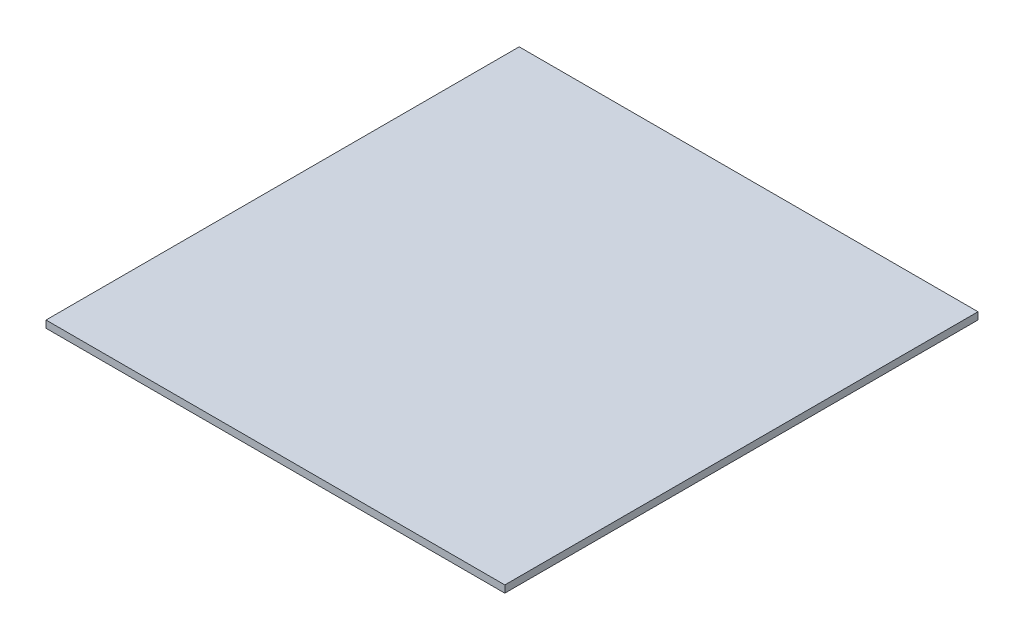
ISO-10303-21;
HEADER;
FILE_DESCRIPTION(('STEP AP214'),'2;1');
FILE_NAME('part.step','',(''),(''),'','','');
FILE_SCHEMA(('AUTOMOTIVE_DESIGN { 1 0 10303 214 1 1 1 1 }'));
ENDSEC;
DATA;
#1=APPLICATION_CONTEXT('core data for automotive mechanical design processes');
#2=APPLICATION_PROTOCOL_DEFINITION('international standard','automotive_design',2000,#1);
#3=PRODUCT_CONTEXT('',#1,'mechanical');
#4=PRODUCT('Part','Part','',(#3));
#5=PRODUCT_RELATED_PRODUCT_CATEGORY('part','',(#4));
#6=PRODUCT_DEFINITION_FORMATION('','',#4);
#7=PRODUCT_DEFINITION_CONTEXT('part definition',#1,'design');
#8=PRODUCT_DEFINITION('design','',#6,#7);
#9=PRODUCT_DEFINITION_SHAPE('','',#8);
#10=(LENGTH_UNIT() NAMED_UNIT(*) SI_UNIT(.MILLI.,.METRE.));
#11=(NAMED_UNIT(*) PLANE_ANGLE_UNIT() SI_UNIT($,.RADIAN.));
#12=(NAMED_UNIT(*) SI_UNIT($,.STERADIAN.) SOLID_ANGLE_UNIT());
#13=UNCERTAINTY_MEASURE_WITH_UNIT(LENGTH_MEASURE(1.E-05),#10,'distance_accuracy_value','');
#14=(GEOMETRIC_REPRESENTATION_CONTEXT(3) GLOBAL_UNCERTAINTY_ASSIGNED_CONTEXT((#13)) GLOBAL_UNIT_ASSIGNED_CONTEXT((#10,
#11,#12)) REPRESENTATION_CONTEXT('',''));
#15=CARTESIAN_POINT('',(0.,0.,0.));
#16=DIRECTION('',(0.,0.,1.));
#17=DIRECTION('',(1.,0.,0.));
#18=AXIS2_PLACEMENT_3D('',#15,#16,#17);
#19=CARTESIAN_POINT('',(-173.,5.,195.));
#20=DIRECTION('',(1.,0.,0.));
#21=DIRECTION('',(0.,0.,-1.));
#22=AXIS2_PLACEMENT_3D('',#19,#20,#21);
#23=PLANE('',#22);
#24=DIRECTION('',(0.,0.,1.));
#25=VECTOR('',#24,1.);
#26=CARTESIAN_POINT('',(-173.,0.,195.));
#27=LINE('',#26,#25);
#28=CARTESIAN_POINT('',(-173.,0.,-135.));
#29=VERTEX_POINT('',#28);
#30=CARTESIAN_POINT('',(-173.,0.,195.));
#31=VERTEX_POINT('',#30);
#32=EDGE_CURVE('E95',#29,#31,#27,.T.);
#33=ORIENTED_EDGE('',*,*,#32,.T.);
#34=DIRECTION('',(0.,-1.,0.));
#35=VECTOR('',#34,1.);
#36=CARTESIAN_POINT('',(-173.,5.,195.));
#37=LINE('',#36,#35);
#38=CARTESIAN_POINT('',(-173.,5.,195.));
#39=VERTEX_POINT('',#38);
#40=EDGE_CURVE('E11',#39,#31,#37,.T.);
#41=ORIENTED_EDGE('',*,*,#40,.F.);
#42=DIRECTION('',(0.,0.,1.));
#43=VECTOR('',#42,1.);
#44=CARTESIAN_POINT('',(-173.,5.,195.));
#45=LINE('',#44,#43);
#46=CARTESIAN_POINT('',(-173.,5.,-135.));
#47=VERTEX_POINT('',#46);
#48=EDGE_CURVE('E83',#47,#39,#45,.T.);
#49=ORIENTED_EDGE('',*,*,#48,.F.);
#50=DIRECTION('',(0.,-1.,0.));
#51=VECTOR('',#50,1.);
#52=CARTESIAN_POINT('',(-173.,5.,-135.));
#53=LINE('',#52,#51);
#54=EDGE_CURVE('E91',#47,#29,#53,.T.);
#55=ORIENTED_EDGE('',*,*,#54,.T.);
#56=EDGE_LOOP('',(#33,#41,#49,#55));
#57=FACE_BOUND('',#56,.T.);
#58=ADVANCED_FACE('F32',(#57),#23,.F.);
#59=CARTESIAN_POINT('',(147.,5.,195.));
#60=DIRECTION('',(0.,0.,-1.));
#61=DIRECTION('',(-1.,0.,0.));
#62=AXIS2_PLACEMENT_3D('',#59,#60,#61);
#63=PLANE('',#62);
#64=DIRECTION('',(1.,0.,0.));
#65=VECTOR('',#64,1.);
#66=CARTESIAN_POINT('',(147.,0.,195.));
#67=LINE('',#66,#65);
#68=CARTESIAN_POINT('',(147.,0.,195.));
#69=VERTEX_POINT('',#68);
#70=EDGE_CURVE('E87',#31,#69,#67,.T.);
#71=ORIENTED_EDGE('',*,*,#70,.T.);
#72=DIRECTION('',(0.,-1.,0.));
#73=VECTOR('',#72,1.);
#74=CARTESIAN_POINT('',(147.,5.,195.));
#75=LINE('',#74,#73);
#76=CARTESIAN_POINT('',(147.,5.,195.));
#77=VERTEX_POINT('',#76);
#78=EDGE_CURVE('E40',#77,#69,#75,.T.);
#79=ORIENTED_EDGE('',*,*,#78,.F.);
#80=DIRECTION('',(1.,0.,0.));
#81=VECTOR('',#80,1.);
#82=CARTESIAN_POINT('',(147.,5.,195.));
#83=LINE('',#82,#81);
#84=EDGE_CURVE('E78',#39,#77,#83,.T.);
#85=ORIENTED_EDGE('',*,*,#84,.F.);
#86=ORIENTED_EDGE('',*,*,#40,.T.);
#87=EDGE_LOOP('',(#71,#79,#85,#86));
#88=FACE_BOUND('',#87,.T.);
#89=ADVANCED_FACE('F86',(#88),#63,.F.);
#90=CARTESIAN_POINT('',(147.,5.,-135.));
#91=DIRECTION('',(-1.,0.,0.));
#92=DIRECTION('',(0.,0.,1.));
#93=AXIS2_PLACEMENT_3D('',#90,#91,#92);
#94=PLANE('',#93);
#95=DIRECTION('',(0.,0.,-1.));
#96=VECTOR('',#95,1.);
#97=CARTESIAN_POINT('',(147.,0.,-135.));
#98=LINE('',#97,#96);
#99=CARTESIAN_POINT('',(147.,0.,-135.));
#100=VERTEX_POINT('',#99);
#101=EDGE_CURVE('E65',#69,#100,#98,.T.);
#102=ORIENTED_EDGE('',*,*,#101,.T.);
#103=DIRECTION('',(0.,-1.,0.));
#104=VECTOR('',#103,1.);
#105=CARTESIAN_POINT('',(147.,5.,-135.));
#106=LINE('',#105,#104);
#107=CARTESIAN_POINT('',(147.,5.,-135.));
#108=VERTEX_POINT('',#107);
#109=EDGE_CURVE('E88',#108,#100,#106,.T.);
#110=ORIENTED_EDGE('',*,*,#109,.F.);
#111=DIRECTION('',(0.,0.,-1.));
#112=VECTOR('',#111,1.);
#113=CARTESIAN_POINT('',(147.,5.,-135.));
#114=LINE('',#113,#112);
#115=EDGE_CURVE('E81',#77,#108,#114,.T.);
#116=ORIENTED_EDGE('',*,*,#115,.F.);
#117=ORIENTED_EDGE('',*,*,#78,.T.);
#118=EDGE_LOOP('',(#102,#110,#116,#117));
#119=FACE_BOUND('',#118,.T.);
#120=ADVANCED_FACE('F89',(#119),#94,.F.);
#121=CARTESIAN_POINT('',(147.,5.,-135.));
#122=DIRECTION('',(0.,0.,1.));
#123=DIRECTION('',(1.,0.,0.));
#124=AXIS2_PLACEMENT_3D('',#121,#122,#123);
#125=PLANE('',#124);
#126=DIRECTION('',(-1.,0.,0.));
#127=VECTOR('',#126,1.);
#128=CARTESIAN_POINT('',(147.,0.,-135.));
#129=LINE('',#128,#127);
#130=EDGE_CURVE('E71',#100,#29,#129,.T.);
#131=ORIENTED_EDGE('',*,*,#130,.T.);
#132=ORIENTED_EDGE('',*,*,#54,.F.);
#133=DIRECTION('',(-1.,0.,0.));
#134=VECTOR('',#133,1.);
#135=CARTESIAN_POINT('',(147.,5.,-135.));
#136=LINE('',#135,#134);
#137=EDGE_CURVE('E48',#108,#47,#136,.T.);
#138=ORIENTED_EDGE('',*,*,#137,.F.);
#139=ORIENTED_EDGE('',*,*,#109,.T.);
#140=EDGE_LOOP('',(#131,#132,#138,#139));
#141=FACE_BOUND('',#140,.T.);
#142=ADVANCED_FACE('F102',(#141),#125,.F.);
#143=CARTESIAN_POINT('',(0.,5.,0.));
#144=DIRECTION('',(0.,1.,0.));
#145=DIRECTION('',(0.,0.,1.));
#146=AXIS2_PLACEMENT_3D('',#143,#144,#145);
#147=PLANE('',#146);
#148=ORIENTED_EDGE('',*,*,#48,.T.);
#149=ORIENTED_EDGE('',*,*,#84,.T.);
#150=ORIENTED_EDGE('',*,*,#115,.T.);
#151=ORIENTED_EDGE('',*,*,#137,.T.);
#152=EDGE_LOOP('',(#148,#149,#150,#151));
#153=FACE_BOUND('',#152,.T.);
#154=ADVANCED_FACE('F79',(#153),#147,.T.);
#155=CARTESIAN_POINT('',(0.,0.,0.));
#156=DIRECTION('',(0.,1.,0.));
#157=DIRECTION('',(0.,0.,1.));
#158=AXIS2_PLACEMENT_3D('',#155,#156,#157);
#159=PLANE('',#158);
#160=ORIENTED_EDGE('',*,*,#32,.F.);
#161=ORIENTED_EDGE('',*,*,#130,.F.);
#162=ORIENTED_EDGE('',*,*,#101,.F.);
#163=ORIENTED_EDGE('',*,*,#70,.F.);
#164=EDGE_LOOP('',(#160,#161,#162,#163));
#165=FACE_BOUND('',#164,.T.);
#166=ADVANCED_FACE('F105',(#165),#159,.F.);
#167=CLOSED_SHELL('',(#58,#89,#120,#142,#154,#166));
#168=MANIFOLD_SOLID_BREP('B2',#167);
#169=ADVANCED_BREP_SHAPE_REPRESENTATION('',(#18,#168),#14);
#170=SHAPE_DEFINITION_REPRESENTATION(#9,#169);
ENDSEC;
END-ISO-10303-21;
